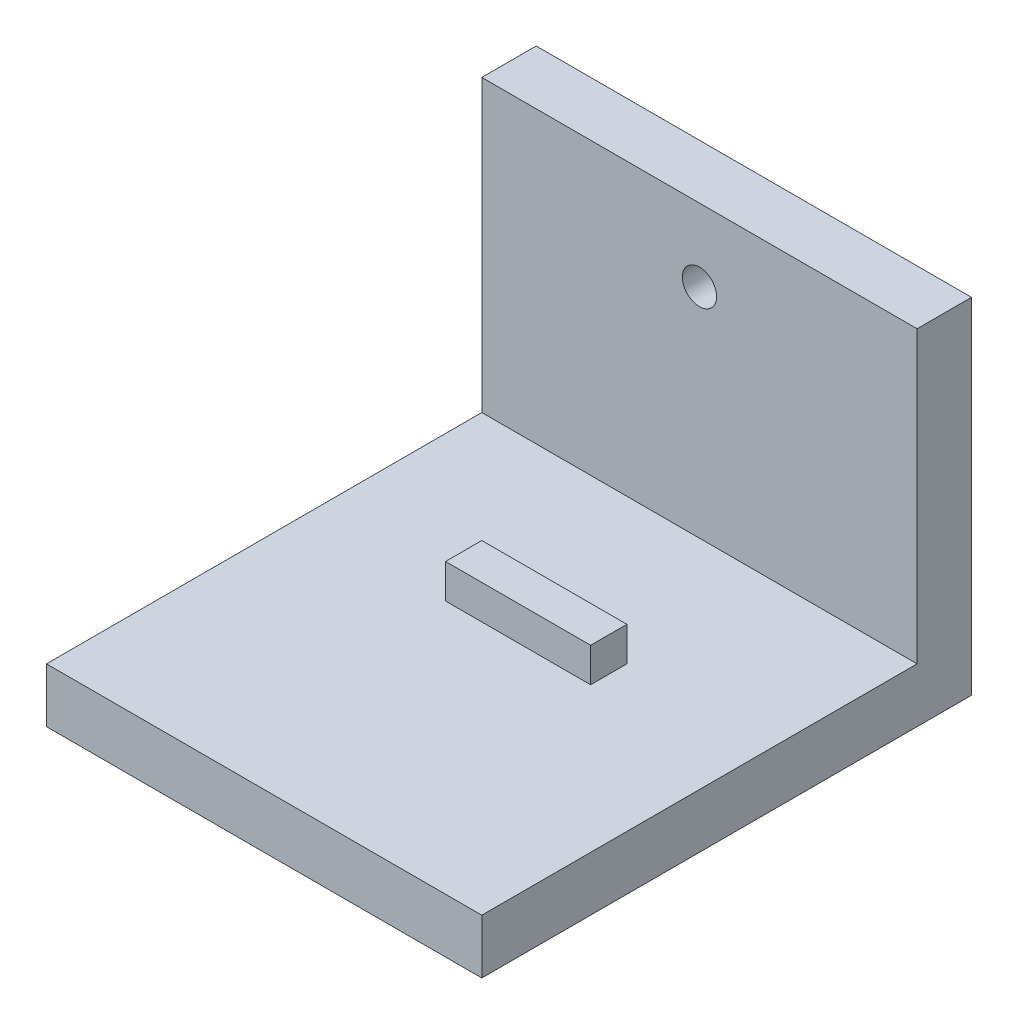
ISO-10303-21;
HEADER;
FILE_DESCRIPTION(('STEP AP214'),'2;1');
FILE_NAME('part.step','',(''),(''),'','','');
FILE_SCHEMA(('AUTOMOTIVE_DESIGN { 1 0 10303 214 1 1 1 1 }'));
ENDSEC;
DATA;
#1=APPLICATION_CONTEXT('core data for automotive mechanical design processes');
#2=APPLICATION_PROTOCOL_DEFINITION('international standard','automotive_design',2000,#1);
#3=PRODUCT_CONTEXT('',#1,'mechanical');
#4=PRODUCT('Part','Part','',(#3));
#5=PRODUCT_RELATED_PRODUCT_CATEGORY('part','',(#4));
#6=PRODUCT_DEFINITION_FORMATION('','',#4);
#7=PRODUCT_DEFINITION_CONTEXT('part definition',#1,'design');
#8=PRODUCT_DEFINITION('design','',#6,#7);
#9=PRODUCT_DEFINITION_SHAPE('','',#8);
#10=(LENGTH_UNIT() NAMED_UNIT(*) SI_UNIT(.MILLI.,.METRE.));
#11=(NAMED_UNIT(*) PLANE_ANGLE_UNIT() SI_UNIT($,.RADIAN.));
#12=(NAMED_UNIT(*) SI_UNIT($,.STERADIAN.) SOLID_ANGLE_UNIT());
#13=UNCERTAINTY_MEASURE_WITH_UNIT(LENGTH_MEASURE(1.E-05),#10,'distance_accuracy_value','');
#14=(GEOMETRIC_REPRESENTATION_CONTEXT(3) GLOBAL_UNCERTAINTY_ASSIGNED_CONTEXT((#13)) GLOBAL_UNIT_ASSIGNED_CONTEXT((#10,
#11,#12)) REPRESENTATION_CONTEXT('',''));
#15=CARTESIAN_POINT('',(0.,0.,0.));
#16=DIRECTION('',(0.,0.,1.));
#17=DIRECTION('',(1.,0.,0.));
#18=AXIS2_PLACEMENT_3D('',#15,#16,#17);
#19=CARTESIAN_POINT('',(38.1,4.7625,42.8625));
#20=DIRECTION('',(0.,-1.,0.));
#21=DIRECTION('',(0.,0.,-1.));
#22=AXIS2_PLACEMENT_3D('',#19,#20,#21);
#23=PLANE('',#22);
#24=DIRECTION('',(0.,0.,1.));
#25=VECTOR('',#24,1.);
#26=CARTESIAN_POINT('',(0.,4.7625,42.8625));
#27=LINE('',#26,#25);
#28=CARTESIAN_POINT('',(0.,4.7625,4.7625));
#29=VERTEX_POINT('',#28);
#30=CARTESIAN_POINT('',(0.,4.7625,42.8625));
#31=VERTEX_POINT('',#30);
#32=EDGE_CURVE('E178',#29,#31,#27,.T.);
#33=ORIENTED_EDGE('',*,*,#32,.T.);
#34=DIRECTION('',(-1.,0.,0.));
#35=VECTOR('',#34,1.);
#36=CARTESIAN_POINT('',(38.1,4.7625,42.8625));
#37=LINE('',#36,#35);
#38=CARTESIAN_POINT('',(38.1,4.7625,42.8625));
#39=VERTEX_POINT('',#38);
#40=EDGE_CURVE('E193',#39,#31,#37,.T.);
#41=ORIENTED_EDGE('',*,*,#40,.F.);
#42=DIRECTION('',(0.,0.,1.));
#43=VECTOR('',#42,1.);
#44=CARTESIAN_POINT('',(38.1,4.7625,42.8625));
#45=LINE('',#44,#43);
#46=CARTESIAN_POINT('',(38.1,4.7625,4.7625));
#47=VERTEX_POINT('',#46);
#48=EDGE_CURVE('E163',#47,#39,#45,.T.);
#49=ORIENTED_EDGE('',*,*,#48,.F.);
#50=DIRECTION('',(-1.,0.,0.));
#51=VECTOR('',#50,1.);
#52=CARTESIAN_POINT('',(38.1,4.7625,4.7625));
#53=LINE('',#52,#51);
#54=EDGE_CURVE('E197',#47,#29,#53,.T.);
#55=ORIENTED_EDGE('',*,*,#54,.T.);
#56=EDGE_LOOP('',(#33,#41,#49,#55));
#57=FACE_BOUND('',#56,.T.);
#58=DIRECTION('',(0.,0.,1.));
#59=VECTOR('',#58,1.);
#60=CARTESIAN_POINT('',(12.7,4.7625,20.6375));
#61=LINE('',#60,#59);
#62=CARTESIAN_POINT('',(12.7,4.7625,17.4625));
#63=VERTEX_POINT('',#62);
#64=CARTESIAN_POINT('',(12.7,4.7625,20.6375));
#65=VERTEX_POINT('',#64);
#66=EDGE_CURVE('E139',#63,#65,#61,.T.);
#67=ORIENTED_EDGE('',*,*,#66,.F.);
#68=DIRECTION('',(-1.,0.,0.));
#69=VECTOR('',#68,1.);
#70=CARTESIAN_POINT('',(12.7,4.7625,17.4625));
#71=LINE('',#70,#69);
#72=CARTESIAN_POINT('',(25.4,4.7625,17.4625));
#73=VERTEX_POINT('',#72);
#74=EDGE_CURVE('E136',#73,#63,#71,.T.);
#75=ORIENTED_EDGE('',*,*,#74,.F.);
#76=DIRECTION('',(0.,0.,-1.));
#77=VECTOR('',#76,1.);
#78=CARTESIAN_POINT('',(25.4,4.7625,20.6375));
#79=LINE('',#78,#77);
#80=CARTESIAN_POINT('',(25.4,4.7625,20.6375));
#81=VERTEX_POINT('',#80);
#82=EDGE_CURVE('E60',#81,#73,#79,.T.);
#83=ORIENTED_EDGE('',*,*,#82,.F.);
#84=DIRECTION('',(1.,0.,0.));
#85=VECTOR('',#84,1.);
#86=CARTESIAN_POINT('',(12.7,4.7625,20.6375));
#87=LINE('',#86,#85);
#88=EDGE_CURVE('E55',#65,#81,#87,.T.);
#89=ORIENTED_EDGE('',*,*,#88,.F.);
#90=EDGE_LOOP('',(#67,#75,#83,#89));
#91=FACE_BOUND('',#90,.T.);
#92=ADVANCED_FACE('F39',(#57,#91),#23,.F.);
#93=CARTESIAN_POINT('',(38.1,30.1625,0.));
#94=DIRECTION('',(0.,0.,1.));
#95=DIRECTION('',(0.,-1.,0.));
#96=AXIS2_PLACEMENT_3D('',#93,#94,#95);
#97=PLANE('',#96);
#98=CARTESIAN_POINT('',(19.05,23.8125,0.));
#99=DIRECTION('',(0.,0.,1.));
#100=DIRECTION('',(1.,0.,0.));
#101=AXIS2_PLACEMENT_3D('',#98,#99,#100);
#102=CIRCLE('',#101,1.499997);
#103=CARTESIAN_POINT('',(20.549997,23.8125,0.));
#104=VERTEX_POINT('',#103);
#105=EDGE_CURVE('E353',#104,#104,#102,.T.);
#106=ORIENTED_EDGE('',*,*,#105,.T.);
#107=EDGE_LOOP('',(#106));
#108=FACE_BOUND('',#107,.T.);
#109=DIRECTION('',(0.,1.,0.));
#110=VECTOR('',#109,1.);
#111=CARTESIAN_POINT('',(0.,30.1625,0.));
#112=LINE('',#111,#110);
#113=CARTESIAN_POINT('',(0.,0.,0.));
#114=VERTEX_POINT('',#113);
#115=CARTESIAN_POINT('',(0.,30.1625,0.));
#116=VERTEX_POINT('',#115);
#117=EDGE_CURVE('E141',#114,#116,#112,.T.);
#118=ORIENTED_EDGE('',*,*,#117,.T.);
#119=DIRECTION('',(-1.,0.,0.));
#120=VECTOR('',#119,1.);
#121=CARTESIAN_POINT('',(38.1,30.1625,0.));
#122=LINE('',#121,#120);
#123=CARTESIAN_POINT('',(38.1,30.1625,0.));
#124=VERTEX_POINT('',#123);
#125=EDGE_CURVE('E11',#124,#116,#122,.T.);
#126=ORIENTED_EDGE('',*,*,#125,.F.);
#127=DIRECTION('',(0.,1.,0.));
#128=VECTOR('',#127,1.);
#129=CARTESIAN_POINT('',(38.1,30.1625,0.));
#130=LINE('',#129,#128);
#131=CARTESIAN_POINT('',(38.1,0.,0.));
#132=VERTEX_POINT('',#131);
#133=EDGE_CURVE('E152',#132,#124,#130,.T.);
#134=ORIENTED_EDGE('',*,*,#133,.F.);
#135=DIRECTION('',(-1.,0.,0.));
#136=VECTOR('',#135,1.);
#137=CARTESIAN_POINT('',(38.1,0.,0.));
#138=LINE('',#137,#136);
#139=EDGE_CURVE('E171',#132,#114,#138,.T.);
#140=ORIENTED_EDGE('',*,*,#139,.T.);
#141=EDGE_LOOP('',(#118,#126,#134,#140));
#142=FACE_BOUND('',#141,.T.);
#143=ADVANCED_FACE('F41',(#108,#142),#97,.F.);
#144=CARTESIAN_POINT('',(38.1,30.1625,4.7625));
#145=DIRECTION('',(0.,-1.,0.));
#146=DIRECTION('',(0.,0.,-1.));
#147=AXIS2_PLACEMENT_3D('',#144,#145,#146);
#148=PLANE('',#147);
#149=DIRECTION('',(0.,0.,1.));
#150=VECTOR('',#149,1.);
#151=CARTESIAN_POINT('',(0.,30.1625,4.7625));
#152=LINE('',#151,#150);
#153=CARTESIAN_POINT('',(0.,30.1625,4.7625));
#154=VERTEX_POINT('',#153);
#155=EDGE_CURVE('E146',#116,#154,#152,.T.);
#156=ORIENTED_EDGE('',*,*,#155,.T.);
#157=DIRECTION('',(-1.,0.,0.));
#158=VECTOR('',#157,1.);
#159=CARTESIAN_POINT('',(38.1,30.1625,4.7625));
#160=LINE('',#159,#158);
#161=CARTESIAN_POINT('',(38.1,30.1625,4.7625));
#162=VERTEX_POINT('',#161);
#163=EDGE_CURVE('E48',#162,#154,#160,.T.);
#164=ORIENTED_EDGE('',*,*,#163,.F.);
#165=DIRECTION('',(0.,0.,1.));
#166=VECTOR('',#165,1.);
#167=CARTESIAN_POINT('',(38.1,30.1625,4.7625));
#168=LINE('',#167,#166);
#169=EDGE_CURVE('E156',#124,#162,#168,.T.);
#170=ORIENTED_EDGE('',*,*,#169,.F.);
#171=ORIENTED_EDGE('',*,*,#125,.T.);
#172=EDGE_LOOP('',(#156,#164,#170,#171));
#173=FACE_BOUND('',#172,.T.);
#174=ADVANCED_FACE('F228',(#173),#148,.F.);
#175=CARTESIAN_POINT('',(38.1,4.7625,4.7625));
#176=DIRECTION('',(0.,0.,-1.));
#177=DIRECTION('',(0.,1.,0.));
#178=AXIS2_PLACEMENT_3D('',#175,#176,#177);
#179=PLANE('',#178);
#180=CARTESIAN_POINT('',(19.05,23.8125,4.7625));
#181=DIRECTION('',(0.,0.,1.));
#182=DIRECTION('',(1.,0.,0.));
#183=AXIS2_PLACEMENT_3D('',#180,#181,#182);
#184=CIRCLE('',#183,1.499997);
#185=CARTESIAN_POINT('',(20.549997,23.8125,4.7625));
#186=VERTEX_POINT('',#185);
#187=EDGE_CURVE('E356',#186,#186,#184,.T.);
#188=ORIENTED_EDGE('',*,*,#187,.F.);
#189=EDGE_LOOP('',(#188));
#190=FACE_BOUND('',#189,.T.);
#191=DIRECTION('',(0.,-1.,0.));
#192=VECTOR('',#191,1.);
#193=CARTESIAN_POINT('',(0.,4.7625,4.7625));
#194=LINE('',#193,#192);
#195=EDGE_CURVE('E175',#154,#29,#194,.T.);
#196=ORIENTED_EDGE('',*,*,#195,.T.);
#197=ORIENTED_EDGE('',*,*,#54,.F.);
#198=DIRECTION('',(0.,-1.,0.));
#199=VECTOR('',#198,1.);
#200=CARTESIAN_POINT('',(38.1,4.7625,4.7625));
#201=LINE('',#200,#199);
#202=EDGE_CURVE('E160',#162,#47,#201,.T.);
#203=ORIENTED_EDGE('',*,*,#202,.F.);
#204=ORIENTED_EDGE('',*,*,#163,.T.);
#205=EDGE_LOOP('',(#196,#197,#203,#204));
#206=FACE_BOUND('',#205,.T.);
#207=ADVANCED_FACE('F206',(#190,#206),#179,.F.);
#208=CARTESIAN_POINT('',(38.1,0.,42.8625));
#209=DIRECTION('',(0.,0.,-1.));
#210=DIRECTION('',(-1.,0.,0.));
#211=AXIS2_PLACEMENT_3D('',#208,#209,#210);
#212=PLANE('',#211);
#213=DIRECTION('',(0.,-1.,0.));
#214=VECTOR('',#213,1.);
#215=CARTESIAN_POINT('',(0.,0.,42.8625));
#216=LINE('',#215,#214);
#217=CARTESIAN_POINT('',(0.,0.,42.8625));
#218=VERTEX_POINT('',#217);
#219=EDGE_CURVE('E181',#31,#218,#216,.T.);
#220=ORIENTED_EDGE('',*,*,#219,.T.);
#221=DIRECTION('',(-1.,0.,0.));
#222=VECTOR('',#221,1.);
#223=CARTESIAN_POINT('',(38.1,0.,42.8625));
#224=LINE('',#223,#222);
#225=CARTESIAN_POINT('',(38.1,0.,42.8625));
#226=VERTEX_POINT('',#225);
#227=EDGE_CURVE('E189',#226,#218,#224,.T.);
#228=ORIENTED_EDGE('',*,*,#227,.F.);
#229=DIRECTION('',(0.,-1.,0.));
#230=VECTOR('',#229,1.);
#231=CARTESIAN_POINT('',(38.1,0.,42.8625));
#232=LINE('',#231,#230);
#233=EDGE_CURVE('E166',#39,#226,#232,.T.);
#234=ORIENTED_EDGE('',*,*,#233,.F.);
#235=ORIENTED_EDGE('',*,*,#40,.T.);
#236=EDGE_LOOP('',(#220,#228,#234,#235));
#237=FACE_BOUND('',#236,.T.);
#238=ADVANCED_FACE('F220',(#237),#212,.F.);
#239=CARTESIAN_POINT('',(38.1,0.,0.));
#240=DIRECTION('',(0.,1.,0.));
#241=DIRECTION('',(0.,0.,1.));
#242=AXIS2_PLACEMENT_3D('',#239,#240,#241);
#243=PLANE('',#242);
#244=DIRECTION('',(0.,0.,-1.));
#245=VECTOR('',#244,1.);
#246=CARTESIAN_POINT('',(0.,0.,0.));
#247=LINE('',#246,#245);
#248=EDGE_CURVE('E157',#218,#114,#247,.T.);
#249=ORIENTED_EDGE('',*,*,#248,.T.);
#250=ORIENTED_EDGE('',*,*,#139,.F.);
#251=DIRECTION('',(0.,0.,-1.));
#252=VECTOR('',#251,1.);
#253=CARTESIAN_POINT('',(38.1,0.,0.));
#254=LINE('',#253,#252);
#255=EDGE_CURVE('E169',#226,#132,#254,.T.);
#256=ORIENTED_EDGE('',*,*,#255,.F.);
#257=ORIENTED_EDGE('',*,*,#227,.T.);
#258=EDGE_LOOP('',(#249,#250,#256,#257));
#259=FACE_BOUND('',#258,.T.);
#260=ADVANCED_FACE('F231',(#259),#243,.F.);
#261=CARTESIAN_POINT('',(38.1,0.,0.));
#262=DIRECTION('',(-1.,0.,0.));
#263=DIRECTION('',(0.,0.,1.));
#264=AXIS2_PLACEMENT_3D('',#261,#262,#263);
#265=PLANE('',#264);
#266=ORIENTED_EDGE('',*,*,#133,.T.);
#267=ORIENTED_EDGE('',*,*,#169,.T.);
#268=ORIENTED_EDGE('',*,*,#202,.T.);
#269=ORIENTED_EDGE('',*,*,#48,.T.);
#270=ORIENTED_EDGE('',*,*,#233,.T.);
#271=ORIENTED_EDGE('',*,*,#255,.T.);
#272=EDGE_LOOP('',(#266,#267,#268,#269,#270,#271));
#273=FACE_BOUND('',#272,.T.);
#274=ADVANCED_FACE('F224',(#273),#265,.F.);
#275=CARTESIAN_POINT('',(0.,0.,0.));
#276=DIRECTION('',(-1.,0.,0.));
#277=DIRECTION('',(0.,0.,1.));
#278=AXIS2_PLACEMENT_3D('',#275,#276,#277);
#279=PLANE('',#278);
#280=ORIENTED_EDGE('',*,*,#117,.F.);
#281=ORIENTED_EDGE('',*,*,#248,.F.);
#282=ORIENTED_EDGE('',*,*,#219,.F.);
#283=ORIENTED_EDGE('',*,*,#32,.F.);
#284=ORIENTED_EDGE('',*,*,#195,.F.);
#285=ORIENTED_EDGE('',*,*,#155,.F.);
#286=EDGE_LOOP('',(#280,#281,#282,#283,#284,#285));
#287=FACE_BOUND('',#286,.T.);
#288=ADVANCED_FACE('F212',(#287),#279,.T.);
#289=CARTESIAN_POINT('',(12.7,7.7597,20.6375));
#290=DIRECTION('',(1.,0.,0.));
#291=DIRECTION('',(0.,0.,-1.));
#292=AXIS2_PLACEMENT_3D('',#289,#290,#291);
#293=PLANE('',#292);
#294=ORIENTED_EDGE('',*,*,#66,.T.);
#295=DIRECTION('',(0.,-1.,0.));
#296=VECTOR('',#295,1.);
#297=CARTESIAN_POINT('',(12.7,7.7597,20.6375));
#298=LINE('',#297,#296);
#299=CARTESIAN_POINT('',(12.7,7.7597,20.6375));
#300=VERTEX_POINT('',#299);
#301=EDGE_CURVE('E118',#300,#65,#298,.T.);
#302=ORIENTED_EDGE('',*,*,#301,.F.);
#303=DIRECTION('',(0.,0.,1.));
#304=VECTOR('',#303,1.);
#305=CARTESIAN_POINT('',(12.7,7.7597,20.6375));
#306=LINE('',#305,#304);
#307=CARTESIAN_POINT('',(12.7,7.7597,17.4625));
#308=VERTEX_POINT('',#307);
#309=EDGE_CURVE('E126',#308,#300,#306,.T.);
#310=ORIENTED_EDGE('',*,*,#309,.F.);
#311=DIRECTION('',(0.,-1.,0.));
#312=VECTOR('',#311,1.);
#313=CARTESIAN_POINT('',(12.7,7.7597,17.4625));
#314=LINE('',#313,#312);
#315=EDGE_CURVE('E366',#308,#63,#314,.T.);
#316=ORIENTED_EDGE('',*,*,#315,.T.);
#317=EDGE_LOOP('',(#294,#302,#310,#316));
#318=FACE_BOUND('',#317,.T.);
#319=ADVANCED_FACE('F138',(#318),#293,.F.);
#320=CARTESIAN_POINT('',(12.7,7.7597,20.6375));
#321=DIRECTION('',(0.,0.,-1.));
#322=DIRECTION('',(0.,1.,0.));
#323=AXIS2_PLACEMENT_3D('',#320,#321,#322);
#324=PLANE('',#323);
#325=ORIENTED_EDGE('',*,*,#88,.T.);
#326=DIRECTION('',(0.,-1.,0.));
#327=VECTOR('',#326,1.);
#328=CARTESIAN_POINT('',(25.4,7.7597,20.6375));
#329=LINE('',#328,#327);
#330=CARTESIAN_POINT('',(25.4,7.7597,20.6375));
#331=VERTEX_POINT('',#330);
#332=EDGE_CURVE('E121',#331,#81,#329,.T.);
#333=ORIENTED_EDGE('',*,*,#332,.F.);
#334=DIRECTION('',(1.,0.,0.));
#335=VECTOR('',#334,1.);
#336=CARTESIAN_POINT('',(12.7,7.7597,20.6375));
#337=LINE('',#336,#335);
#338=EDGE_CURVE('E114',#300,#331,#337,.T.);
#339=ORIENTED_EDGE('',*,*,#338,.F.);
#340=ORIENTED_EDGE('',*,*,#301,.T.);
#341=EDGE_LOOP('',(#325,#333,#339,#340));
#342=FACE_BOUND('',#341,.T.);
#343=ADVANCED_FACE('F116',(#342),#324,.F.);
#344=CARTESIAN_POINT('',(25.4,7.7597,20.6375));
#345=DIRECTION('',(-1.,0.,0.));
#346=DIRECTION('',(0.,0.,1.));
#347=AXIS2_PLACEMENT_3D('',#344,#345,#346);
#348=PLANE('',#347);
#349=ORIENTED_EDGE('',*,*,#82,.T.);
#350=DIRECTION('',(0.,-1.,0.));
#351=VECTOR('',#350,1.);
#352=CARTESIAN_POINT('',(25.4,7.7597,17.4625));
#353=LINE('',#352,#351);
#354=CARTESIAN_POINT('',(25.4,7.7597,17.4625));
#355=VERTEX_POINT('',#354);
#356=EDGE_CURVE('E148',#355,#73,#353,.T.);
#357=ORIENTED_EDGE('',*,*,#356,.F.);
#358=DIRECTION('',(0.,0.,-1.));
#359=VECTOR('',#358,1.);
#360=CARTESIAN_POINT('',(25.4,7.7597,20.6375));
#361=LINE('',#360,#359);
#362=EDGE_CURVE('E125',#331,#355,#361,.T.);
#363=ORIENTED_EDGE('',*,*,#362,.F.);
#364=ORIENTED_EDGE('',*,*,#332,.T.);
#365=EDGE_LOOP('',(#349,#357,#363,#364));
#366=FACE_BOUND('',#365,.T.);
#367=ADVANCED_FACE('F302',(#366),#348,.F.);
#368=CARTESIAN_POINT('',(12.7,7.7597,17.4625));
#369=DIRECTION('',(0.,0.,1.));
#370=DIRECTION('',(0.,-1.,0.));
#371=AXIS2_PLACEMENT_3D('',#368,#369,#370);
#372=PLANE('',#371);
#373=ORIENTED_EDGE('',*,*,#74,.T.);
#374=ORIENTED_EDGE('',*,*,#315,.F.);
#375=DIRECTION('',(-1.,0.,0.));
#376=VECTOR('',#375,1.);
#377=CARTESIAN_POINT('',(12.7,7.7597,17.4625));
#378=LINE('',#377,#376);
#379=EDGE_CURVE('E131',#355,#308,#378,.T.);
#380=ORIENTED_EDGE('',*,*,#379,.F.);
#381=ORIENTED_EDGE('',*,*,#356,.T.);
#382=EDGE_LOOP('',(#373,#374,#380,#381));
#383=FACE_BOUND('',#382,.T.);
#384=ADVANCED_FACE('F311',(#383),#372,.F.);
#385=CARTESIAN_POINT('',(0.,7.7597,0.));
#386=DIRECTION('',(0.,-1.,0.));
#387=DIRECTION('',(0.,0.,-1.));
#388=AXIS2_PLACEMENT_3D('',#385,#386,#387);
#389=PLANE('',#388);
#390=ORIENTED_EDGE('',*,*,#309,.T.);
#391=ORIENTED_EDGE('',*,*,#338,.T.);
#392=ORIENTED_EDGE('',*,*,#362,.T.);
#393=ORIENTED_EDGE('',*,*,#379,.T.);
#394=EDGE_LOOP('',(#390,#391,#392,#393));
#395=FACE_BOUND('',#394,.T.);
#396=ADVANCED_FACE('F129',(#395),#389,.F.);
#397=CARTESIAN_POINT('',(19.05,23.8125,0.));
#398=DIRECTION('',(0.,0.,1.));
#399=DIRECTION('',(1.,0.,0.));
#400=AXIS2_PLACEMENT_3D('',#397,#398,#399);
#401=CYLINDRICAL_SURFACE('',#400,1.499997);
#402=ORIENTED_EDGE('',*,*,#105,.F.);
#403=EDGE_LOOP('',(#402));
#404=FACE_BOUND('',#403,.T.);
#405=ORIENTED_EDGE('',*,*,#187,.T.);
#406=EDGE_LOOP('',(#405));
#407=FACE_BOUND('',#406,.T.);
#408=ADVANCED_FACE('F329',(#404,#407),#401,.F.);
#409=CLOSED_SHELL('',(#92,#143,#174,#207,#238,#260,#274,#288,#319,#343,#367,#384,#396,#408));
#410=MANIFOLD_SOLID_BREP('B2',#409);
#411=ADVANCED_BREP_SHAPE_REPRESENTATION('',(#18,#410),#14);
#412=SHAPE_DEFINITION_REPRESENTATION(#9,#411);
ENDSEC;
END-ISO-10303-21;
